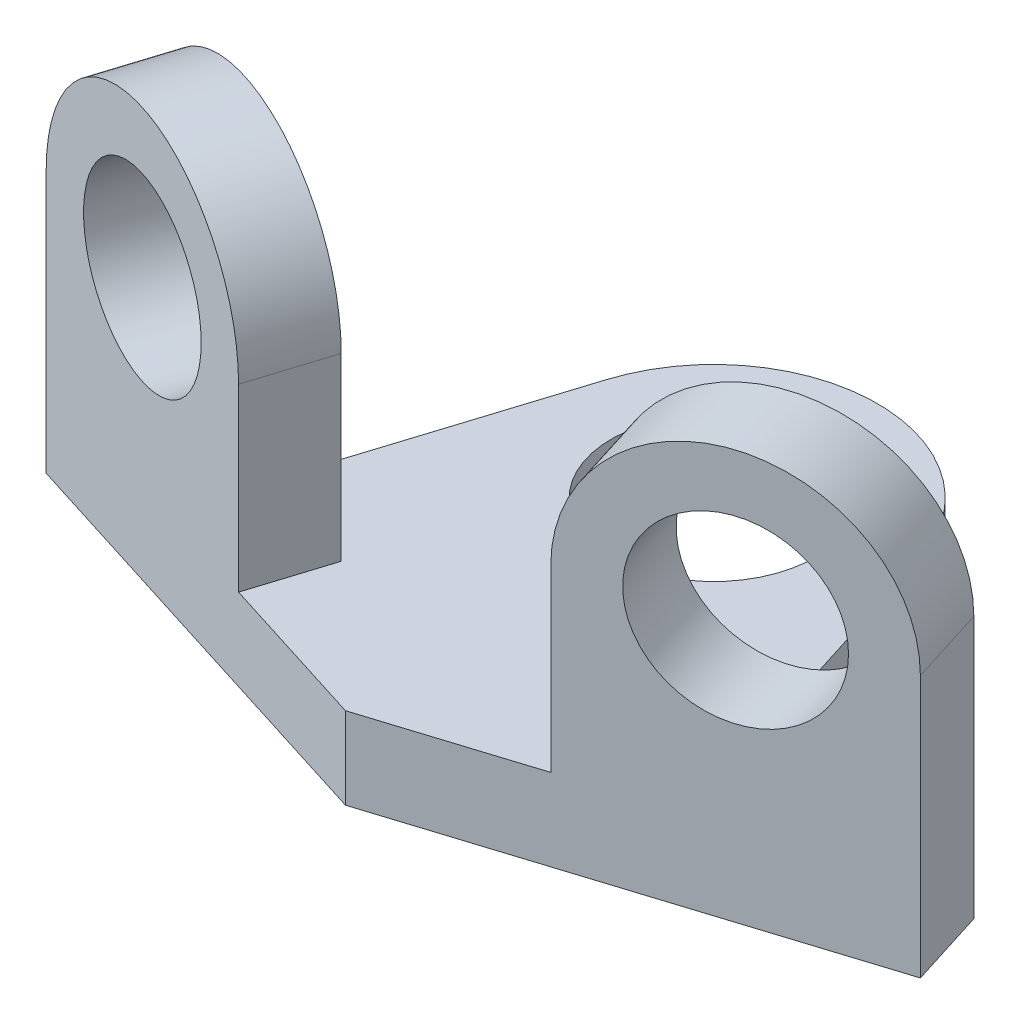
ISO-10303-21;
HEADER;
FILE_DESCRIPTION(('STEP AP214'),'2;1');
FILE_NAME('part.step','',(''),(''),'','','');
FILE_SCHEMA(('AUTOMOTIVE_DESIGN { 1 0 10303 214 1 1 1 1 }'));
ENDSEC;
DATA;
#1=APPLICATION_CONTEXT('core data for automotive mechanical design processes');
#2=APPLICATION_PROTOCOL_DEFINITION('international standard','automotive_design',2000,#1);
#3=PRODUCT_CONTEXT('',#1,'mechanical');
#4=PRODUCT('Part','Part','',(#3));
#5=PRODUCT_RELATED_PRODUCT_CATEGORY('part','',(#4));
#6=PRODUCT_DEFINITION_FORMATION('','',#4);
#7=PRODUCT_DEFINITION_CONTEXT('part definition',#1,'design');
#8=PRODUCT_DEFINITION('design','',#6,#7);
#9=PRODUCT_DEFINITION_SHAPE('','',#8);
#10=(LENGTH_UNIT() NAMED_UNIT(*) SI_UNIT(.MILLI.,.METRE.));
#11=(NAMED_UNIT(*) PLANE_ANGLE_UNIT() SI_UNIT($,.RADIAN.));
#12=(NAMED_UNIT(*) SI_UNIT($,.STERADIAN.) SOLID_ANGLE_UNIT());
#13=UNCERTAINTY_MEASURE_WITH_UNIT(LENGTH_MEASURE(1.E-05),#10,'distance_accuracy_value','');
#14=(GEOMETRIC_REPRESENTATION_CONTEXT(3) GLOBAL_UNCERTAINTY_ASSIGNED_CONTEXT((#13)) GLOBAL_UNIT_ASSIGNED_CONTEXT((#10,
#11,#12)) REPRESENTATION_CONTEXT('',''));
#15=CARTESIAN_POINT('',(0.,0.,0.));
#16=DIRECTION('',(0.,0.,1.));
#17=DIRECTION('',(1.,0.,0.));
#18=AXIS2_PLACEMENT_3D('',#15,#16,#17);
#19=CARTESIAN_POINT('',(0.,10.,0.));
#20=DIRECTION('',(0.,1.,0.));
#21=DIRECTION('',(0.,0.,1.));
#22=AXIS2_PLACEMENT_3D('',#19,#20,#21);
#23=PLANE('',#22);
#24=CARTESIAN_POINT('',(0.,10.,-45.));
#25=DIRECTION('',(0.,1.,0.));
#26=DIRECTION('',(0.,0.,1.));
#27=AXIS2_PLACEMENT_3D('',#24,#25,#26);
#28=CIRCLE('',#27,12.5);
#29=CARTESIAN_POINT('',(0.,10.,-32.5));
#30=VERTEX_POINT('',#29);
#31=EDGE_CURVE('E211',#30,#30,#28,.T.);
#32=ORIENTED_EDGE('',*,*,#31,.F.);
#33=EDGE_LOOP('',(#32));
#34=FACE_BOUND('',#33,.T.);
#35=DIRECTION('',(0.953716950748227,0.,0.300705799504274));
#36=VECTOR('',#35,1.);
#37=CARTESIAN_POINT('',(3.00705799504273,10.,-9.53716950748226));
#38=LINE('',#37,#36);
#39=CARTESIAN_POINT('',(-28.9727508378204,10.,-19.6203645010654));
#40=VERTEX_POINT('',#39);
#41=CARTESIAN_POINT('',(-16.0672810199218,10.,-15.5512854975677));
#42=VERTEX_POINT('',#41);
#43=EDGE_CURVE('E47',#40,#42,#38,.T.);
#44=ORIENTED_EDGE('',*,*,#43,.T.);
#45=DIRECTION('',(-0.300705799504274,0.,0.953716950748227));
#46=VECTOR('',#45,1.);
#47=CARTESIAN_POINT('',(-19.0743390149645,10.,-6.01411599008547));
#48=LINE('',#47,#46);
#49=CARTESIAN_POINT('',(-19.0743390149645,10.,-6.01411599008547));
#50=VERTEX_POINT('',#49);
#51=EDGE_CURVE('E11',#42,#50,#48,.T.);
#52=ORIENTED_EDGE('',*,*,#51,.T.);
#53=DIRECTION('',(-0.953716950748227,0.,-0.300705799504274));
#54=VECTOR('',#53,1.);
#55=CARTESIAN_POINT('',(0.,10.,0.));
#56=LINE('',#55,#54);
#57=CARTESIAN_POINT('',(0.,10.,0.));
#58=VERTEX_POINT('',#57);
#59=EDGE_CURVE('E208',#58,#50,#56,.T.);
#60=ORIENTED_EDGE('',*,*,#59,.F.);
#61=DIRECTION('',(0.953716950748227,0.,-0.300705799504273));
#62=VECTOR('',#61,1.);
#63=CARTESIAN_POINT('',(0.,10.,0.));
#64=LINE('',#63,#62);
#65=CARTESIAN_POINT('',(19.0743390149645,10.,-6.01411599008547));
#66=VERTEX_POINT('',#65);
#67=EDGE_CURVE('E196',#58,#66,#64,.T.);
#68=ORIENTED_EDGE('',*,*,#67,.T.);
#69=DIRECTION('',(0.300705799504274,0.,0.953716950748227));
#70=VECTOR('',#69,1.);
#71=CARTESIAN_POINT('',(19.0743390149645,10.,-6.01411599008547));
#72=LINE('',#71,#70);
#73=CARTESIAN_POINT('',(16.0672810199218,10.,-15.5512854975677));
#74=VERTEX_POINT('',#73);
#75=EDGE_CURVE('E65',#74,#66,#72,.T.);
#76=ORIENTED_EDGE('',*,*,#75,.F.);
#77=DIRECTION('',(0.953716950748227,0.,-0.300705799504273));
#78=VECTOR('',#77,1.);
#79=CARTESIAN_POINT('',(-3.00705799504274,10.,-9.53716950748227));
#80=LINE('',#79,#78);
#81=CARTESIAN_POINT('',(28.9727508378204,10.,-19.6203645010654));
#82=VERTEX_POINT('',#81);
#83=EDGE_CURVE('E252',#74,#82,#80,.T.);
#84=ORIENTED_EDGE('',*,*,#83,.T.);
#85=DIRECTION('',(0.300705799504274,0.,0.953716950748227));
#86=VECTOR('',#85,1.);
#87=CARTESIAN_POINT('',(31.9798088328631,10.,-10.0831949935832));
#88=LINE('',#87,#86);
#89=CARTESIAN_POINT('',(19.0743390149645,10.,-51.0141159900855));
#90=VERTEX_POINT('',#89);
#91=EDGE_CURVE('E199',#90,#82,#88,.T.);
#92=ORIENTED_EDGE('',*,*,#91,.F.);
#93=CARTESIAN_POINT('',(0.,10.,-45.));
#94=DIRECTION('',(0.,1.,0.));
#95=DIRECTION('',(0.,0.,1.));
#96=AXIS2_PLACEMENT_3D('',#93,#94,#95);
#97=CIRCLE('',#96,20.);
#98=CARTESIAN_POINT('',(-19.0743390149645,10.,-51.0141159900855));
#99=VERTEX_POINT('',#98);
#100=EDGE_CURVE('E201',#90,#99,#97,.T.);
#101=ORIENTED_EDGE('',*,*,#100,.T.);
#102=DIRECTION('',(-0.300705799504274,0.,0.953716950748227));
#103=VECTOR('',#102,1.);
#104=CARTESIAN_POINT('',(-31.9798088328631,10.,-10.0831949935832));
#105=LINE('',#104,#103);
#106=EDGE_CURVE('E202',#99,#40,#105,.T.);
#107=ORIENTED_EDGE('',*,*,#106,.T.);
#108=EDGE_LOOP('',(#44,#52,#60,#68,#76,#84,#92,#101,#107));
#109=FACE_BOUND('',#108,.T.);
#110=ADVANCED_FACE('F41',(#34,#109),#23,.T.);
#111=CARTESIAN_POINT('',(0.,10.,0.));
#112=DIRECTION('',(-0.300705799504273,0.,-0.953716950748227));
#113=DIRECTION('',(-0.953716950748227,0.,0.300705799504273));
#114=AXIS2_PLACEMENT_3D('',#111,#112,#113);
#115=PLANE('',#114);
#116=DIRECTION('',(0.,-1.,0.));
#117=VECTOR('',#116,1.);
#118=CARTESIAN_POINT('',(53.4081492419007,10.,-16.8395247722393));
#119=LINE('',#118,#117);
#120=CARTESIAN_POINT('',(53.4081492419007,32.,-16.8395247722393));
#121=VERTEX_POINT('',#120);
#122=CARTESIAN_POINT('',(53.4081492419007,0.,-16.8395247722393));
#123=VERTEX_POINT('',#122);
#124=EDGE_CURVE('E246',#121,#123,#119,.T.);
#125=ORIENTED_EDGE('',*,*,#124,.F.);
#126=CARTESIAN_POINT('',(36.2412441284326,32.,-11.4268203811624));
#127=DIRECTION('',(0.300705799504273,0.,0.953716950748227));
#128=DIRECTION('',(0.953716950748227,0.,-0.300705799504273));
#129=AXIS2_PLACEMENT_3D('',#126,#127,#128);
#130=CIRCLE('',#129,18.);
#131=CARTESIAN_POINT('',(19.0743390149645,32.,-6.01411599008547));
#132=VERTEX_POINT('',#131);
#133=EDGE_CURVE('E187',#121,#132,#130,.T.);
#134=ORIENTED_EDGE('',*,*,#133,.T.);
#135=DIRECTION('',(0.,-1.,0.));
#136=VECTOR('',#135,1.);
#137=CARTESIAN_POINT('',(19.0743390149645,0.,-6.01411599008547));
#138=LINE('',#137,#136);
#139=EDGE_CURVE('E176',#132,#66,#138,.T.);
#140=ORIENTED_EDGE('',*,*,#139,.T.);
#141=ORIENTED_EDGE('',*,*,#67,.F.);
#142=DIRECTION('',(0.,-1.,0.));
#143=VECTOR('',#142,1.);
#144=CARTESIAN_POINT('',(0.,10.,0.));
#145=LINE('',#144,#143);
#146=CARTESIAN_POINT('',(0.,0.,0.));
#147=VERTEX_POINT('',#146);
#148=EDGE_CURVE('E212',#58,#147,#145,.T.);
#149=ORIENTED_EDGE('',*,*,#148,.T.);
#150=DIRECTION('',(0.953716950748227,0.,-0.300705799504273));
#151=VECTOR('',#150,1.);
#152=CARTESIAN_POINT('',(0.,0.,0.));
#153=LINE('',#152,#151);
#154=EDGE_CURVE('E198',#147,#123,#153,.T.);
#155=ORIENTED_EDGE('',*,*,#154,.T.);
#156=EDGE_LOOP('',(#125,#134,#140,#141,#149,#155));
#157=FACE_BOUND('',#156,.T.);
#158=CARTESIAN_POINT('',(36.2412441284326,32.,-11.4268203811624));
#159=DIRECTION('',(0.300705799504273,0.,0.953716950748227));
#160=DIRECTION('',(0.953716950748227,0.,-0.300705799504273));
#161=AXIS2_PLACEMENT_3D('',#158,#159,#160);
#162=CIRCLE('',#161,11.);
#163=CARTESIAN_POINT('',(46.7321305866631,32.,-14.7345841757094));
#164=VERTEX_POINT('',#163);
#165=EDGE_CURVE('E172',#164,#164,#162,.T.);
#166=ORIENTED_EDGE('',*,*,#165,.F.);
#167=EDGE_LOOP('',(#166));
#168=FACE_BOUND('',#167,.T.);
#169=ADVANCED_FACE('F43',(#157,#168),#115,.F.);
#170=CARTESIAN_POINT('',(53.4081492419007,10.,-16.8395247722393));
#171=DIRECTION('',(-0.953716950748227,0.,0.300705799504273));
#172=DIRECTION('',(0.300705799504273,0.,0.953716950748227));
#173=AXIS2_PLACEMENT_3D('',#170,#171,#172);
#174=PLANE('',#173);
#175=DIRECTION('',(-0.300705799504273,0.,-0.953716950748227));
#176=VECTOR('',#175,1.);
#177=CARTESIAN_POINT('',(53.4081492419007,0.,-16.8395247722393));
#178=LINE('',#177,#176);
#179=CARTESIAN_POINT('',(50.401091246858,0.,-26.3766942797216));
#180=VERTEX_POINT('',#179);
#181=EDGE_CURVE('E216',#123,#180,#178,.T.);
#182=ORIENTED_EDGE('',*,*,#181,.T.);
#183=DIRECTION('',(0.,-1.,0.));
#184=VECTOR('',#183,1.);
#185=CARTESIAN_POINT('',(50.401091246858,10.,-26.3766942797216));
#186=LINE('',#185,#184);
#187=CARTESIAN_POINT('',(50.401091246858,32.,-26.3766942797216));
#188=VERTEX_POINT('',#187);
#189=EDGE_CURVE('E247',#188,#180,#186,.T.);
#190=ORIENTED_EDGE('',*,*,#189,.F.);
#191=DIRECTION('',(0.300705799504274,0.,0.953716950748227));
#192=VECTOR('',#191,1.);
#193=CARTESIAN_POINT('',(50.401091246858,32.,-26.3766942797216));
#194=LINE('',#193,#192);
#195=EDGE_CURVE('E195',#188,#121,#194,.T.);
#196=ORIENTED_EDGE('',*,*,#195,.T.);
#197=ORIENTED_EDGE('',*,*,#124,.T.);
#198=EDGE_LOOP('',(#182,#190,#196,#197));
#199=FACE_BOUND('',#198,.T.);
#200=ADVANCED_FACE('F294',(#199),#174,.F.);
#201=CARTESIAN_POINT('',(-3.00705799504274,10.,-9.53716950748227));
#202=DIRECTION('',(0.300705799504273,0.,0.953716950748227));
#203=DIRECTION('',(0.953716950748227,0.,-0.300705799504273));
#204=AXIS2_PLACEMENT_3D('',#201,#202,#203);
#205=PLANE('',#204);
#206=DIRECTION('',(-0.953716950748227,0.,0.300705799504273));
#207=VECTOR('',#206,1.);
#208=CARTESIAN_POINT('',(-3.00705799504274,0.,-9.53716950748227));
#209=LINE('',#208,#207);
#210=CARTESIAN_POINT('',(28.9727508378204,0.,-19.6203645010654));
#211=VERTEX_POINT('',#210);
#212=EDGE_CURVE('E217',#180,#211,#209,.T.);
#213=ORIENTED_EDGE('',*,*,#212,.T.);
#214=DIRECTION('',(0.,-1.,0.));
#215=VECTOR('',#214,1.);
#216=CARTESIAN_POINT('',(28.9727508378204,10.,-19.6203645010654));
#217=LINE('',#216,#215);
#218=EDGE_CURVE('E245',#82,#211,#217,.T.);
#219=ORIENTED_EDGE('',*,*,#218,.F.);
#220=ORIENTED_EDGE('',*,*,#83,.F.);
#221=DIRECTION('',(0.,-1.,0.));
#222=VECTOR('',#221,1.);
#223=CARTESIAN_POINT('',(16.0672810199218,0.,-15.5512854975677));
#224=LINE('',#223,#222);
#225=CARTESIAN_POINT('',(16.0672810199218,32.,-15.5512854975677));
#226=VERTEX_POINT('',#225);
#227=EDGE_CURVE('E185',#226,#74,#224,.T.);
#228=ORIENTED_EDGE('',*,*,#227,.F.);
#229=CARTESIAN_POINT('',(33.2341861333899,32.,-20.9639898886447));
#230=DIRECTION('',(0.300705799504273,0.,0.953716950748227));
#231=DIRECTION('',(0.953716950748227,0.,-0.300705799504273));
#232=AXIS2_PLACEMENT_3D('',#229,#230,#231);
#233=CIRCLE('',#232,18.);
#234=EDGE_CURVE('E180',#188,#226,#233,.T.);
#235=ORIENTED_EDGE('',*,*,#234,.F.);
#236=ORIENTED_EDGE('',*,*,#189,.T.);
#237=EDGE_LOOP('',(#213,#219,#220,#228,#235,#236));
#238=FACE_BOUND('',#237,.T.);
#239=CARTESIAN_POINT('',(33.2341861333899,32.,-20.9639898886447));
#240=DIRECTION('',(0.300705799504273,0.,0.953716950748227));
#241=DIRECTION('',(0.953716950748227,0.,-0.300705799504273));
#242=AXIS2_PLACEMENT_3D('',#239,#240,#241);
#243=CIRCLE('',#242,11.);
#244=CARTESIAN_POINT('',(43.7250725916204,32.,-24.2717536831917));
#245=VERTEX_POINT('',#244);
#246=EDGE_CURVE('E171',#245,#245,#243,.T.);
#247=ORIENTED_EDGE('',*,*,#246,.T.);
#248=EDGE_LOOP('',(#247));
#249=FACE_BOUND('',#248,.T.);
#250=ADVANCED_FACE('F325',(#238,#249),#205,.F.);
#251=CARTESIAN_POINT('',(31.9798088328631,10.,-10.0831949935832));
#252=DIRECTION('',(0.953716950748227,0.,-0.300705799504274));
#253=DIRECTION('',(-0.300705799504274,0.,-0.953716950748227));
#254=AXIS2_PLACEMENT_3D('',#251,#252,#253);
#255=PLANE('',#254);
#256=DIRECTION('',(0.300705799504274,0.,0.953716950748227));
#257=VECTOR('',#256,1.);
#258=CARTESIAN_POINT('',(31.9798088328631,0.,-10.0831949935832));
#259=LINE('',#258,#257);
#260=CARTESIAN_POINT('',(19.0743390149645,0.,-51.0141159900855));
#261=VERTEX_POINT('',#260);
#262=EDGE_CURVE('E222',#261,#211,#259,.T.);
#263=ORIENTED_EDGE('',*,*,#262,.F.);
#264=DIRECTION('',(0.,-1.,0.));
#265=VECTOR('',#264,1.);
#266=CARTESIAN_POINT('',(19.0743390149645,10.,-51.0141159900855));
#267=LINE('',#266,#265);
#268=EDGE_CURVE('E244',#90,#261,#267,.T.);
#269=ORIENTED_EDGE('',*,*,#268,.F.);
#270=ORIENTED_EDGE('',*,*,#91,.T.);
#271=ORIENTED_EDGE('',*,*,#218,.T.);
#272=EDGE_LOOP('',(#263,#269,#270,#271));
#273=FACE_BOUND('',#272,.T.);
#274=ADVANCED_FACE('F318',(#273),#255,.T.);
#275=CARTESIAN_POINT('',(0.,10.,-45.));
#276=DIRECTION('',(0.,-1.,0.));
#277=DIRECTION('',(0.,0.,-1.));
#278=AXIS2_PLACEMENT_3D('',#275,#276,#277);
#279=CYLINDRICAL_SURFACE('',#278,20.);
#280=CARTESIAN_POINT('',(0.,0.,-45.));
#281=DIRECTION('',(0.,1.,0.));
#282=DIRECTION('',(0.,0.,1.));
#283=AXIS2_PLACEMENT_3D('',#280,#281,#282);
#284=CIRCLE('',#283,20.);
#285=CARTESIAN_POINT('',(-19.0743390149645,0.,-51.0141159900855));
#286=VERTEX_POINT('',#285);
#287=EDGE_CURVE('E221',#261,#286,#284,.T.);
#288=ORIENTED_EDGE('',*,*,#287,.T.);
#289=DIRECTION('',(0.,-1.,0.));
#290=VECTOR('',#289,1.);
#291=CARTESIAN_POINT('',(-19.0743390149645,10.,-51.0141159900855));
#292=LINE('',#291,#290);
#293=EDGE_CURVE('E239',#99,#286,#292,.T.);
#294=ORIENTED_EDGE('',*,*,#293,.F.);
#295=ORIENTED_EDGE('',*,*,#100,.F.);
#296=ORIENTED_EDGE('',*,*,#268,.T.);
#297=EDGE_LOOP('',(#288,#294,#295,#296));
#298=FACE_BOUND('',#297,.T.);
#299=ADVANCED_FACE('F312',(#298),#279,.T.);
#300=CARTESIAN_POINT('',(-31.9798088328631,10.,-10.0831949935832));
#301=DIRECTION('',(0.953716950748227,0.,0.300705799504274));
#302=DIRECTION('',(0.300705799504274,0.,-0.953716950748227));
#303=AXIS2_PLACEMENT_3D('',#300,#301,#302);
#304=PLANE('',#303);
#305=DIRECTION('',(-0.300705799504274,0.,0.953716950748227));
#306=VECTOR('',#305,1.);
#307=CARTESIAN_POINT('',(-31.9798088328631,0.,-10.0831949935832));
#308=LINE('',#307,#306);
#309=CARTESIAN_POINT('',(-28.9727508378204,0.,-19.6203645010654));
#310=VERTEX_POINT('',#309);
#311=EDGE_CURVE('E228',#286,#310,#308,.T.);
#312=ORIENTED_EDGE('',*,*,#311,.T.);
#313=DIRECTION('',(0.,-1.,0.));
#314=VECTOR('',#313,1.);
#315=CARTESIAN_POINT('',(-28.9727508378204,10.,-19.6203645010654));
#316=LINE('',#315,#314);
#317=EDGE_CURVE('E150',#40,#310,#316,.T.);
#318=ORIENTED_EDGE('',*,*,#317,.F.);
#319=ORIENTED_EDGE('',*,*,#106,.F.);
#320=ORIENTED_EDGE('',*,*,#293,.T.);
#321=EDGE_LOOP('',(#312,#318,#319,#320));
#322=FACE_BOUND('',#321,.T.);
#323=ADVANCED_FACE('F257',(#322),#304,.F.);
#324=CARTESIAN_POINT('',(3.00705799504274,10.,-9.53716950748227));
#325=DIRECTION('',(0.300705799504274,0.,-0.953716950748227));
#326=DIRECTION('',(-0.953716950748227,0.,-0.300705799504274));
#327=AXIS2_PLACEMENT_3D('',#324,#325,#326);
#328=PLANE('',#327);
#329=DIRECTION('',(0.953716950748227,0.,0.300705799504274));
#330=VECTOR('',#329,1.);
#331=CARTESIAN_POINT('',(3.00705799504274,0.,-9.53716950748227));
#332=LINE('',#331,#330);
#333=CARTESIAN_POINT('',(-50.401091246858,0.,-26.3766942797216));
#334=VERTEX_POINT('',#333);
#335=EDGE_CURVE('E141',#334,#310,#332,.T.);
#336=ORIENTED_EDGE('',*,*,#335,.F.);
#337=DIRECTION('',(0.,-1.,0.));
#338=VECTOR('',#337,1.);
#339=CARTESIAN_POINT('',(-50.401091246858,10.,-26.3766942797216));
#340=LINE('',#339,#338);
#341=CARTESIAN_POINT('',(-50.401091246858,32.,-26.3766942797216));
#342=VERTEX_POINT('',#341);
#343=EDGE_CURVE('E137',#342,#334,#340,.T.);
#344=ORIENTED_EDGE('',*,*,#343,.F.);
#345=CARTESIAN_POINT('',(-33.2341861333899,32.,-20.9639898886447));
#346=DIRECTION('',(-0.300705799504274,0.,0.953716950748227));
#347=DIRECTION('',(0.953716950748227,0.,0.300705799504274));
#348=AXIS2_PLACEMENT_3D('',#345,#346,#347);
#349=CIRCLE('',#348,18.);
#350=CARTESIAN_POINT('',(-16.0672810199218,32.,-15.5512854975677));
#351=VERTEX_POINT('',#350);
#352=EDGE_CURVE('E143',#351,#342,#349,.T.);
#353=ORIENTED_EDGE('',*,*,#352,.F.);
#354=DIRECTION('',(0.,-1.,0.));
#355=VECTOR('',#354,1.);
#356=CARTESIAN_POINT('',(-16.0672810199218,0.,-15.5512854975677));
#357=LINE('',#356,#355);
#358=EDGE_CURVE('E57',#351,#42,#357,.T.);
#359=ORIENTED_EDGE('',*,*,#358,.T.);
#360=ORIENTED_EDGE('',*,*,#43,.F.);
#361=ORIENTED_EDGE('',*,*,#317,.T.);
#362=EDGE_LOOP('',(#336,#344,#353,#359,#360,#361));
#363=FACE_BOUND('',#362,.T.);
#364=CARTESIAN_POINT('',(-33.2341861333899,32.,-20.9639898886447));
#365=DIRECTION('',(-0.300705799504274,0.,0.953716950748227));
#366=DIRECTION('',(0.953716950748227,0.,0.300705799504274));
#367=AXIS2_PLACEMENT_3D('',#364,#365,#366);
#368=CIRCLE('',#367,11.);
#369=CARTESIAN_POINT('',(-22.7432996751594,32.,-17.6562260940977));
#370=VERTEX_POINT('',#369);
#371=EDGE_CURVE('E159',#370,#370,#368,.T.);
#372=ORIENTED_EDGE('',*,*,#371,.T.);
#373=EDGE_LOOP('',(#372));
#374=FACE_BOUND('',#373,.T.);
#375=ADVANCED_FACE('F140',(#363,#374),#328,.T.);
#376=CARTESIAN_POINT('',(-53.4081492419007,10.,-16.8395247722393));
#377=DIRECTION('',(-0.953716950748227,0.,-0.300705799504273));
#378=DIRECTION('',(-0.300705799504273,0.,0.953716950748227));
#379=AXIS2_PLACEMENT_3D('',#376,#377,#378);
#380=PLANE('',#379);
#381=DIRECTION('',(0.300705799504273,0.,-0.953716950748227));
#382=VECTOR('',#381,1.);
#383=CARTESIAN_POINT('',(-53.4081492419007,0.,-16.8395247722393));
#384=LINE('',#383,#382);
#385=CARTESIAN_POINT('',(-53.4081492419007,0.,-16.8395247722393));
#386=VERTEX_POINT('',#385);
#387=EDGE_CURVE('E226',#386,#334,#384,.T.);
#388=ORIENTED_EDGE('',*,*,#387,.F.);
#389=DIRECTION('',(0.,-1.,0.));
#390=VECTOR('',#389,1.);
#391=CARTESIAN_POINT('',(-53.4081492419007,10.,-16.8395247722393));
#392=LINE('',#391,#390);
#393=CARTESIAN_POINT('',(-53.4081492419007,32.,-16.8395247722393));
#394=VERTEX_POINT('',#393);
#395=EDGE_CURVE('E146',#394,#386,#392,.T.);
#396=ORIENTED_EDGE('',*,*,#395,.F.);
#397=DIRECTION('',(-0.300705799504274,0.,0.953716950748227));
#398=VECTOR('',#397,1.);
#399=CARTESIAN_POINT('',(-50.401091246858,32.,-26.3766942797216));
#400=LINE('',#399,#398);
#401=EDGE_CURVE('E151',#342,#394,#400,.T.);
#402=ORIENTED_EDGE('',*,*,#401,.F.);
#403=ORIENTED_EDGE('',*,*,#343,.T.);
#404=EDGE_LOOP('',(#388,#396,#402,#403));
#405=FACE_BOUND('',#404,.T.);
#406=ADVANCED_FACE('F155',(#405),#380,.T.);
#407=CARTESIAN_POINT('',(0.,10.,0.));
#408=DIRECTION('',(-0.300705799504274,0.,0.953716950748227));
#409=DIRECTION('',(0.953716950748227,0.,0.300705799504274));
#410=AXIS2_PLACEMENT_3D('',#407,#408,#409);
#411=PLANE('',#410);
#412=ORIENTED_EDGE('',*,*,#395,.T.);
#413=DIRECTION('',(-0.953716950748227,0.,-0.300705799504274));
#414=VECTOR('',#413,1.);
#415=CARTESIAN_POINT('',(0.,0.,0.));
#416=LINE('',#415,#414);
#417=EDGE_CURVE('E234',#147,#386,#416,.T.);
#418=ORIENTED_EDGE('',*,*,#417,.F.);
#419=ORIENTED_EDGE('',*,*,#148,.F.);
#420=ORIENTED_EDGE('',*,*,#59,.T.);
#421=DIRECTION('',(0.,-1.,0.));
#422=VECTOR('',#421,1.);
#423=CARTESIAN_POINT('',(-19.0743390149645,0.,-6.01411599008547));
#424=LINE('',#423,#422);
#425=CARTESIAN_POINT('',(-19.0743390149645,32.,-6.01411599008547));
#426=VERTEX_POINT('',#425);
#427=EDGE_CURVE('E163',#426,#50,#424,.T.);
#428=ORIENTED_EDGE('',*,*,#427,.F.);
#429=CARTESIAN_POINT('',(-36.2412441284326,32.,-11.4268203811624));
#430=DIRECTION('',(-0.300705799504274,0.,0.953716950748227));
#431=DIRECTION('',(0.953716950748227,0.,0.300705799504274));
#432=AXIS2_PLACEMENT_3D('',#429,#430,#431);
#433=CIRCLE('',#432,18.);
#434=EDGE_CURVE('E168',#426,#394,#433,.T.);
#435=ORIENTED_EDGE('',*,*,#434,.T.);
#436=EDGE_LOOP('',(#412,#418,#419,#420,#428,#435));
#437=FACE_BOUND('',#436,.T.);
#438=CARTESIAN_POINT('',(-36.2412441284326,32.,-11.4268203811624));
#439=DIRECTION('',(-0.300705799504274,0.,0.953716950748227));
#440=DIRECTION('',(0.953716950748227,0.,0.300705799504274));
#441=AXIS2_PLACEMENT_3D('',#438,#439,#440);
#442=CIRCLE('',#441,11.);
#443=CARTESIAN_POINT('',(-25.7503576702021,32.,-8.11905658661539));
#444=VERTEX_POINT('',#443);
#445=EDGE_CURVE('E170',#444,#444,#442,.T.);
#446=ORIENTED_EDGE('',*,*,#445,.F.);
#447=EDGE_LOOP('',(#446));
#448=FACE_BOUND('',#447,.T.);
#449=ADVANCED_FACE('F269',(#437,#448),#411,.T.);
#450=CARTESIAN_POINT('',(0.,10.,-45.));
#451=DIRECTION('',(0.,-1.,0.));
#452=DIRECTION('',(0.,0.,-1.));
#453=AXIS2_PLACEMENT_3D('',#450,#451,#452);
#454=CYLINDRICAL_SURFACE('',#453,12.5);
#455=ORIENTED_EDGE('',*,*,#31,.T.);
#456=EDGE_LOOP('',(#455));
#457=FACE_BOUND('',#456,.T.);
#458=CARTESIAN_POINT('',(0.,0.,-45.));
#459=DIRECTION('',(0.,1.,0.));
#460=DIRECTION('',(0.,0.,1.));
#461=AXIS2_PLACEMENT_3D('',#458,#459,#460);
#462=CIRCLE('',#461,12.5);
#463=CARTESIAN_POINT('',(0.,0.,-32.5));
#464=VERTEX_POINT('',#463);
#465=EDGE_CURVE('E203',#464,#464,#462,.T.);
#466=ORIENTED_EDGE('',*,*,#465,.F.);
#467=EDGE_LOOP('',(#466));
#468=FACE_BOUND('',#467,.T.);
#469=ADVANCED_FACE('F301',(#457,#468),#454,.F.);
#470=CARTESIAN_POINT('',(0.,0.,0.));
#471=DIRECTION('',(0.,1.,0.));
#472=DIRECTION('',(0.,0.,1.));
#473=AXIS2_PLACEMENT_3D('',#470,#471,#472);
#474=PLANE('',#473);
#475=ORIENTED_EDGE('',*,*,#335,.T.);
#476=ORIENTED_EDGE('',*,*,#311,.F.);
#477=ORIENTED_EDGE('',*,*,#287,.F.);
#478=ORIENTED_EDGE('',*,*,#262,.T.);
#479=ORIENTED_EDGE('',*,*,#212,.F.);
#480=ORIENTED_EDGE('',*,*,#181,.F.);
#481=ORIENTED_EDGE('',*,*,#154,.F.);
#482=ORIENTED_EDGE('',*,*,#417,.T.);
#483=ORIENTED_EDGE('',*,*,#387,.T.);
#484=EDGE_LOOP('',(#475,#476,#477,#478,#479,#480,#481,#482,#483));
#485=FACE_BOUND('',#484,.T.);
#486=ORIENTED_EDGE('',*,*,#465,.T.);
#487=EDGE_LOOP('',(#486));
#488=FACE_BOUND('',#487,.T.);
#489=ADVANCED_FACE('F262',(#485,#488),#474,.F.);
#490=CARTESIAN_POINT('',(33.2341861333899,32.,-20.9639898886447));
#491=DIRECTION('',(0.300705799504274,0.,0.953716950748227));
#492=DIRECTION('',(0.953716950748227,0.,-0.300705799504274));
#493=AXIS2_PLACEMENT_3D('',#490,#491,#492);
#494=CYLINDRICAL_SURFACE('',#493,18.);
#495=ORIENTED_EDGE('',*,*,#133,.F.);
#496=ORIENTED_EDGE('',*,*,#195,.F.);
#497=ORIENTED_EDGE('',*,*,#234,.T.);
#498=DIRECTION('',(0.300705799504274,0.,0.953716950748227));
#499=VECTOR('',#498,1.);
#500=CARTESIAN_POINT('',(16.0672810199218,32.,-15.5512854975677));
#501=LINE('',#500,#499);
#502=EDGE_CURVE('E183',#226,#132,#501,.T.);
#503=ORIENTED_EDGE('',*,*,#502,.T.);
#504=EDGE_LOOP('',(#495,#496,#497,#503));
#505=FACE_BOUND('',#504,.T.);
#506=ADVANCED_FACE('F305',(#505),#494,.T.);
#507=CARTESIAN_POINT('',(33.2341861333899,32.,-20.9639898886447));
#508=DIRECTION('',(0.300705799504274,0.,0.953716950748227));
#509=DIRECTION('',(0.953716950748227,0.,-0.300705799504274));
#510=AXIS2_PLACEMENT_3D('',#507,#508,#509);
#511=CYLINDRICAL_SURFACE('',#510,11.);
#512=ORIENTED_EDGE('',*,*,#246,.F.);
#513=EDGE_LOOP('',(#512));
#514=FACE_BOUND('',#513,.T.);
#515=ORIENTED_EDGE('',*,*,#165,.T.);
#516=EDGE_LOOP('',(#515));
#517=FACE_BOUND('',#516,.T.);
#518=ADVANCED_FACE('F300',(#514,#517),#511,.F.);
#519=CARTESIAN_POINT('',(16.0672810199218,0.,-15.5512854975677));
#520=DIRECTION('',(-0.953716950748227,0.,0.300705799504274));
#521=DIRECTION('',(0.300705799504274,0.,0.953716950748227));
#522=AXIS2_PLACEMENT_3D('',#519,#520,#521);
#523=PLANE('',#522);
#524=ORIENTED_EDGE('',*,*,#227,.T.);
#525=ORIENTED_EDGE('',*,*,#75,.T.);
#526=ORIENTED_EDGE('',*,*,#139,.F.);
#527=ORIENTED_EDGE('',*,*,#502,.F.);
#528=EDGE_LOOP('',(#524,#525,#526,#527));
#529=FACE_BOUND('',#528,.T.);
#530=ADVANCED_FACE('F285',(#529),#523,.T.);
#531=CARTESIAN_POINT('',(-33.2341861333899,32.,-20.9639898886447));
#532=DIRECTION('',(-0.300705799504274,0.,0.953716950748227));
#533=DIRECTION('',(0.953716950748227,0.,0.300705799504274));
#534=AXIS2_PLACEMENT_3D('',#531,#532,#533);
#535=CYLINDRICAL_SURFACE('',#534,18.);
#536=ORIENTED_EDGE('',*,*,#434,.F.);
#537=DIRECTION('',(-0.300705799504274,0.,0.953716950748227));
#538=VECTOR('',#537,1.);
#539=CARTESIAN_POINT('',(-16.0672810199218,32.,-15.5512854975677));
#540=LINE('',#539,#538);
#541=EDGE_CURVE('E160',#351,#426,#540,.T.);
#542=ORIENTED_EDGE('',*,*,#541,.F.);
#543=ORIENTED_EDGE('',*,*,#352,.T.);
#544=ORIENTED_EDGE('',*,*,#401,.T.);
#545=EDGE_LOOP('',(#536,#542,#543,#544));
#546=FACE_BOUND('',#545,.T.);
#547=ADVANCED_FACE('F157',(#546),#535,.T.);
#548=CARTESIAN_POINT('',(-16.0672810199218,0.,-15.5512854975677));
#549=DIRECTION('',(-0.953716950748227,0.,-0.300705799504274));
#550=DIRECTION('',(-0.300705799504274,0.,0.953716950748227));
#551=AXIS2_PLACEMENT_3D('',#548,#549,#550);
#552=PLANE('',#551);
#553=ORIENTED_EDGE('',*,*,#51,.F.);
#554=ORIENTED_EDGE('',*,*,#358,.F.);
#555=ORIENTED_EDGE('',*,*,#541,.T.);
#556=ORIENTED_EDGE('',*,*,#427,.T.);
#557=EDGE_LOOP('',(#553,#554,#555,#556));
#558=FACE_BOUND('',#557,.T.);
#559=ADVANCED_FACE('F273',(#558),#552,.F.);
#560=CARTESIAN_POINT('',(-33.2341861333899,32.,-20.9639898886447));
#561=DIRECTION('',(-0.300705799504274,0.,0.953716950748227));
#562=DIRECTION('',(0.953716950748227,0.,0.300705799504274));
#563=AXIS2_PLACEMENT_3D('',#560,#561,#562);
#564=CYLINDRICAL_SURFACE('',#563,11.);
#565=ORIENTED_EDGE('',*,*,#371,.F.);
#566=EDGE_LOOP('',(#565));
#567=FACE_BOUND('',#566,.T.);
#568=ORIENTED_EDGE('',*,*,#445,.T.);
#569=EDGE_LOOP('',(#568));
#570=FACE_BOUND('',#569,.T.);
#571=ADVANCED_FACE('F277',(#567,#570),#564,.F.);
#572=CLOSED_SHELL('',(#110,#169,#200,#250,#274,#299,#323,#375,#406,#449,#469,#489,#506,#518,
#530,#547,#559,#571));
#573=MANIFOLD_SOLID_BREP('B2',#572);
#574=ADVANCED_BREP_SHAPE_REPRESENTATION('',(#18,#573),#14);
#575=SHAPE_DEFINITION_REPRESENTATION(#9,#574);
ENDSEC;
END-ISO-10303-21;
